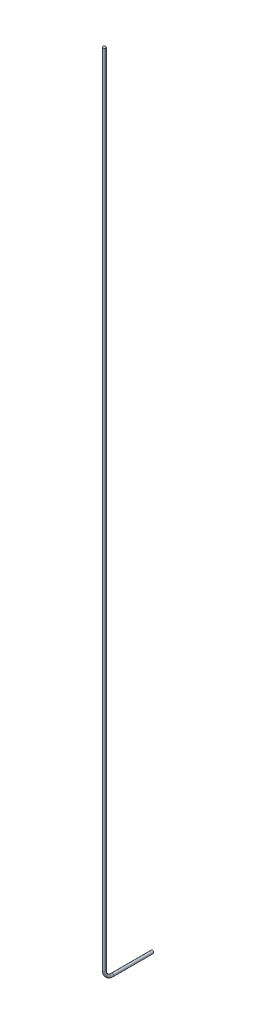
ISO-10303-21;
HEADER;
FILE_DESCRIPTION(('STEP AP214'),'2;1');
FILE_NAME('part.step','',(''),(''),'','','');
FILE_SCHEMA(('AUTOMOTIVE_DESIGN { 1 0 10303 214 1 1 1 1 }'));
ENDSEC;
DATA;
#1=APPLICATION_CONTEXT('core data for automotive mechanical design processes');
#2=APPLICATION_PROTOCOL_DEFINITION('international standard','automotive_design',2000,#1);
#3=PRODUCT_CONTEXT('',#1,'mechanical');
#4=PRODUCT('Part','Part','',(#3));
#5=PRODUCT_RELATED_PRODUCT_CATEGORY('part','',(#4));
#6=PRODUCT_DEFINITION_FORMATION('','',#4);
#7=PRODUCT_DEFINITION_CONTEXT('part definition',#1,'design');
#8=PRODUCT_DEFINITION('design','',#6,#7);
#9=PRODUCT_DEFINITION_SHAPE('','',#8);
#10=(LENGTH_UNIT() NAMED_UNIT(*) SI_UNIT(.MILLI.,.METRE.));
#11=(NAMED_UNIT(*) PLANE_ANGLE_UNIT() SI_UNIT($,.RADIAN.));
#12=(NAMED_UNIT(*) SI_UNIT($,.STERADIAN.) SOLID_ANGLE_UNIT());
#13=UNCERTAINTY_MEASURE_WITH_UNIT(LENGTH_MEASURE(1.E-05),#10,'distance_accuracy_value','');
#14=(GEOMETRIC_REPRESENTATION_CONTEXT(3) GLOBAL_UNCERTAINTY_ASSIGNED_CONTEXT((#13)) GLOBAL_UNIT_ASSIGNED_CONTEXT((#10,
#11,#12)) REPRESENTATION_CONTEXT('',''));
#15=CARTESIAN_POINT('',(0.,0.,0.));
#16=DIRECTION('',(0.,0.,1.));
#17=DIRECTION('',(1.,0.,0.));
#18=AXIS2_PLACEMENT_3D('',#15,#16,#17);
#19=CARTESIAN_POINT('',(0.,0.,20.));
#20=DIRECTION('',(0.,0.,-1.));
#21=DIRECTION('',(-1.,0.,0.));
#22=AXIS2_PLACEMENT_3D('',#19,#20,#21);
#23=CYLINDRICAL_SURFACE('',#22,0.9);
#24=CARTESIAN_POINT('',(0.,0.,0.));
#25=DIRECTION('',(0.,0.,1.));
#26=DIRECTION('',(1.,0.,0.));
#27=AXIS2_PLACEMENT_3D('',#24,#25,#26);
#28=CIRCLE('',#27,0.9);
#29=CARTESIAN_POINT('',(0.9,0.,0.));
#30=VERTEX_POINT('',#29);
#31=EDGE_CURVE('E10',#30,#30,#28,.T.);
#32=ORIENTED_EDGE('',*,*,#31,.T.);
#33=EDGE_LOOP('',(#32));
#34=FACE_BOUND('',#33,.T.);
#35=CARTESIAN_POINT('',(0.,0.,25.));
#36=DIRECTION('',(0.,0.,1.));
#37=DIRECTION('',(1.,0.,0.));
#38=AXIS2_PLACEMENT_3D('',#35,#36,#37);
#39=CIRCLE('',#38,0.9);
#40=CARTESIAN_POINT('',(0.,-0.899999999999836,25.));
#41=VERTEX_POINT('',#40);
#42=EDGE_CURVE('E56',#41,#41,#39,.T.);
#43=ORIENTED_EDGE('',*,*,#42,.F.);
#44=EDGE_LOOP('',(#43));
#45=FACE_BOUND('',#44,.T.);
#46=ADVANCED_FACE('F39',(#34,#45),#23,.T.);
#47=CARTESIAN_POINT('',(0.,0.,0.));
#48=DIRECTION('',(0.,0.,1.));
#49=DIRECTION('',(1.,0.,0.));
#50=AXIS2_PLACEMENT_3D('',#47,#48,#49);
#51=PLANE('',#50);
#52=ORIENTED_EDGE('',*,*,#31,.F.);
#53=EDGE_LOOP('',(#52));
#54=FACE_BOUND('',#53,.T.);
#55=ADVANCED_FACE('F66',(#54),#51,.F.);
#56=CARTESIAN_POINT('',(0.,505.,30.));
#57=DIRECTION('',(0.,1.,0.));
#58=DIRECTION('',(1.,0.,0.));
#59=AXIS2_PLACEMENT_3D('',#56,#57,#58);
#60=PLANE('',#59);
#61=CARTESIAN_POINT('',(0.,505.,30.));
#62=DIRECTION('',(0.,1.,0.));
#63=DIRECTION('',(1.,0.,0.));
#64=AXIS2_PLACEMENT_3D('',#61,#62,#63);
#65=CIRCLE('',#64,0.9);
#66=CARTESIAN_POINT('',(0.9,505.,30.));
#67=VERTEX_POINT('',#66);
#68=EDGE_CURVE('E46',#67,#67,#65,.T.);
#69=ORIENTED_EDGE('',*,*,#68,.T.);
#70=EDGE_LOOP('',(#69));
#71=FACE_BOUND('',#70,.T.);
#72=ADVANCED_FACE('F70',(#71),#60,.T.);
#73=CARTESIAN_POINT('',(0.,5.,25.));
#74=DIRECTION('',(-1.,0.,0.));
#75=DIRECTION('',(0.,0.,1.));
#76=AXIS2_PLACEMENT_3D('',#73,#74,#75);
#77=TOROIDAL_SURFACE('',#76,4.99999999999984,0.9);
#78=CARTESIAN_POINT('',(0.,5.,30.));
#79=DIRECTION('',(0.,1.,0.));
#80=DIRECTION('',(1.,0.,0.));
#81=AXIS2_PLACEMENT_3D('',#78,#79,#80);
#82=CIRCLE('',#81,0.9);
#83=CARTESIAN_POINT('',(0.,5.,30.8999999999998));
#84=VERTEX_POINT('',#83);
#85=EDGE_CURVE('E51',#84,#84,#82,.T.);
#86=CARTESIAN_POINT('',(0.,5.,25.));
#87=DIRECTION('',(-1.,0.,0.));
#88=DIRECTION('',(0.,0.,1.));
#89=AXIS2_PLACEMENT_3D('',#86,#87,#88);
#90=CIRCLE('',#89,5.89999999999984);
#91=EDGE_CURVE('',#41,#84,#90,.T.);
#92=ORIENTED_EDGE('',*,*,#42,.T.);
#93=ORIENTED_EDGE('',*,*,#85,.F.);
#94=ORIENTED_EDGE('',*,*,#91,.T.);
#95=ORIENTED_EDGE('',*,*,#91,.F.);
#96=EDGE_LOOP('',(#92,#94,#93,#95));
#97=FACE_BOUND('',#96,.T.);
#98=ADVANCED_FACE('F63',(#97),#77,.T.);
#99=CARTESIAN_POINT('',(0.,5.,30.));
#100=DIRECTION('',(0.,1.,0.));
#101=DIRECTION('',(0.,0.,1.));
#102=AXIS2_PLACEMENT_3D('',#99,#100,#101);
#103=CYLINDRICAL_SURFACE('',#102,0.9);
#104=ORIENTED_EDGE('',*,*,#68,.F.);
#105=EDGE_LOOP('',(#104));
#106=FACE_BOUND('',#105,.T.);
#107=ORIENTED_EDGE('',*,*,#85,.T.);
#108=EDGE_LOOP('',(#107));
#109=FACE_BOUND('',#108,.T.);
#110=ADVANCED_FACE('F72',(#106,#109),#103,.T.);
#111=CLOSED_SHELL('',(#46,#55,#72,#98,#110));
#112=MANIFOLD_SOLID_BREP('B2',#111);
#113=ADVANCED_BREP_SHAPE_REPRESENTATION('',(#18,#112),#14);
#114=SHAPE_DEFINITION_REPRESENTATION(#9,#113);
ENDSEC;
END-ISO-10303-21;
